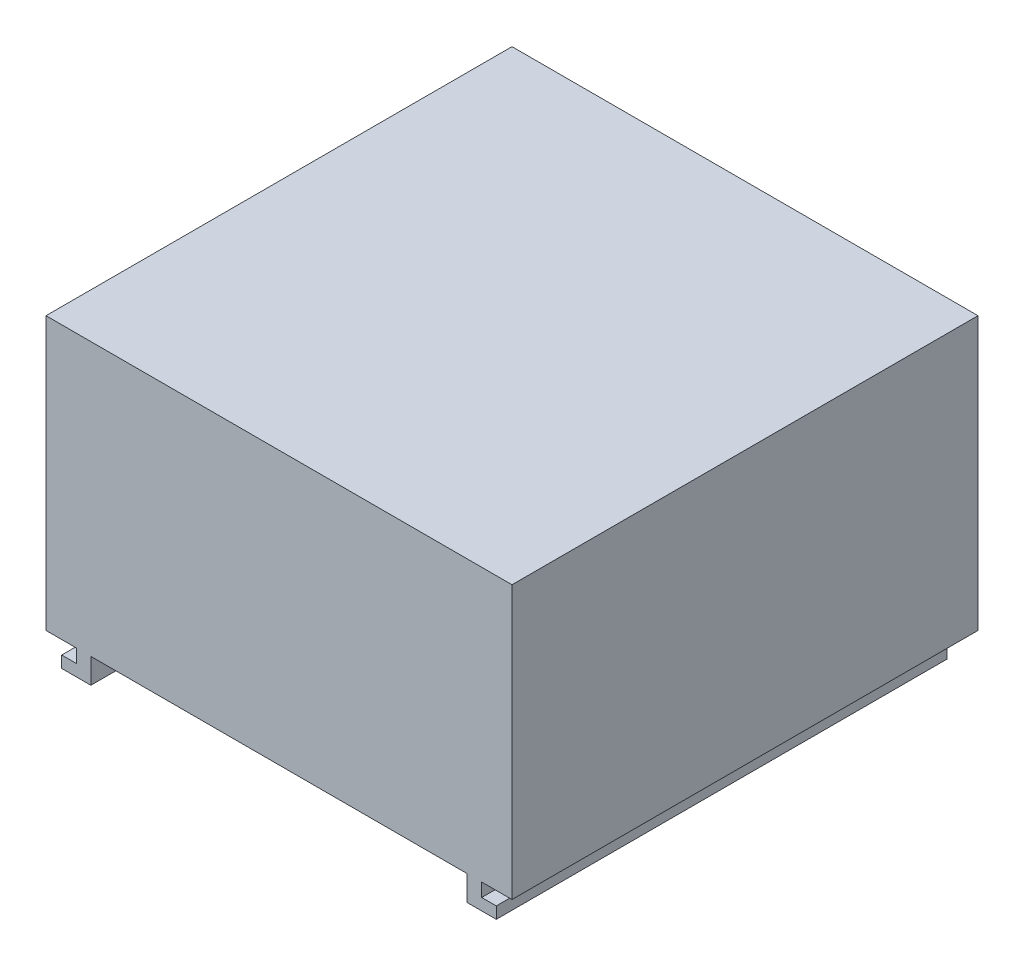
ISO-10303-21;
HEADER;
FILE_DESCRIPTION(('STEP AP214'),'2;1');
FILE_NAME('part.step','',(''),(''),'','','');
FILE_SCHEMA(('AUTOMOTIVE_DESIGN { 1 0 10303 214 1 1 1 1 }'));
ENDSEC;
DATA;
#1=APPLICATION_CONTEXT('core data for automotive mechanical design processes');
#2=APPLICATION_PROTOCOL_DEFINITION('international standard','automotive_design',2000,#1);
#3=PRODUCT_CONTEXT('',#1,'mechanical');
#4=PRODUCT('Part','Part','',(#3));
#5=PRODUCT_RELATED_PRODUCT_CATEGORY('part','',(#4));
#6=PRODUCT_DEFINITION_FORMATION('','',#4);
#7=PRODUCT_DEFINITION_CONTEXT('part definition',#1,'design');
#8=PRODUCT_DEFINITION('design','',#6,#7);
#9=PRODUCT_DEFINITION_SHAPE('','',#8);
#10=(LENGTH_UNIT() NAMED_UNIT(*) SI_UNIT(.MILLI.,.METRE.));
#11=(NAMED_UNIT(*) PLANE_ANGLE_UNIT() SI_UNIT($,.RADIAN.));
#12=(NAMED_UNIT(*) SI_UNIT($,.STERADIAN.) SOLID_ANGLE_UNIT());
#13=UNCERTAINTY_MEASURE_WITH_UNIT(LENGTH_MEASURE(1.E-05),#10,'distance_accuracy_value','');
#14=(GEOMETRIC_REPRESENTATION_CONTEXT(3) GLOBAL_UNCERTAINTY_ASSIGNED_CONTEXT((#13)) GLOBAL_UNIT_ASSIGNED_CONTEXT((#10,
#11,#12)) REPRESENTATION_CONTEXT('',''));
#15=CARTESIAN_POINT('',(0.,0.,0.));
#16=DIRECTION('',(0.,0.,1.));
#17=DIRECTION('',(1.,0.,0.));
#18=AXIS2_PLACEMENT_3D('',#15,#16,#17);
#19=CARTESIAN_POINT('',(-32.3,-6.301,38.5));
#20=DIRECTION('',(0.,0.,1.));
#21=DIRECTION('',(1.,0.,0.));
#22=AXIS2_PLACEMENT_3D('',#19,#20,#21);
#23=PLANE('',#22);
#24=DIRECTION('',(-1.,0.,0.));
#25=VECTOR('',#24,1.);
#26=CARTESIAN_POINT('',(-32.3,43.3,38.5));
#27=LINE('',#26,#25);
#28=CARTESIAN_POINT('',(38.5,43.3,38.5));
#29=VERTEX_POINT('',#28);
#30=CARTESIAN_POINT('',(-38.5,43.3,38.5));
#31=VERTEX_POINT('',#30);
#32=EDGE_CURVE('E201',#29,#31,#27,.T.);
#33=ORIENTED_EDGE('',*,*,#32,.F.);
#34=DIRECTION('',(0.,-1.,0.));
#35=VECTOR('',#34,1.);
#36=CARTESIAN_POINT('',(38.5,44.8,38.5));
#37=LINE('',#36,#35);
#38=CARTESIAN_POINT('',(38.5,0.,38.5));
#39=VERTEX_POINT('',#38);
#40=EDGE_CURVE('E206',#29,#39,#37,.T.);
#41=ORIENTED_EDGE('',*,*,#40,.T.);
#42=DIRECTION('',(1.,0.,0.));
#43=VECTOR('',#42,1.);
#44=CARTESIAN_POINT('',(-38.5,0.,38.5));
#45=LINE('',#44,#43);
#46=CARTESIAN_POINT('',(32.3,0.,38.5));
#47=VERTEX_POINT('',#46);
#48=EDGE_CURVE('E361',#47,#39,#45,.T.);
#49=ORIENTED_EDGE('',*,*,#48,.F.);
#50=DIRECTION('',(0.,1.,0.));
#51=VECTOR('',#50,1.);
#52=CARTESIAN_POINT('',(32.3,-6.301,38.5));
#53=LINE('',#52,#51);
#54=CARTESIAN_POINT('',(32.3,-1.99999999999999,38.5));
#55=VERTEX_POINT('',#54);
#56=EDGE_CURVE('E247',#55,#47,#53,.T.);
#57=ORIENTED_EDGE('',*,*,#56,.F.);
#58=DIRECTION('',(-1.,0.,0.));
#59=VECTOR('',#58,1.);
#60=CARTESIAN_POINT('',(-32.3,-2.,38.5));
#61=LINE('',#60,#59);
#62=CARTESIAN_POINT('',(-32.3,-2.,38.5));
#63=VERTEX_POINT('',#62);
#64=EDGE_CURVE('E237',#55,#63,#61,.T.);
#65=ORIENTED_EDGE('',*,*,#64,.T.);
#66=DIRECTION('',(0.,1.,0.));
#67=VECTOR('',#66,1.);
#68=CARTESIAN_POINT('',(-32.3,-6.301,38.5));
#69=LINE('',#68,#67);
#70=CARTESIAN_POINT('',(-32.3,0.,38.5));
#71=VERTEX_POINT('',#70);
#72=EDGE_CURVE('E251',#63,#71,#69,.T.);
#73=ORIENTED_EDGE('',*,*,#72,.T.);
#74=CARTESIAN_POINT('',(-38.5,0.,38.5));
#75=VERTEX_POINT('',#74);
#76=EDGE_CURVE('E505',#75,#71,#45,.T.);
#77=ORIENTED_EDGE('',*,*,#76,.F.);
#78=DIRECTION('',(0.,-1.,0.));
#79=VECTOR('',#78,1.);
#80=CARTESIAN_POINT('',(-38.5,44.8,38.5));
#81=LINE('',#80,#79);
#82=EDGE_CURVE('E208',#31,#75,#81,.T.);
#83=ORIENTED_EDGE('',*,*,#82,.F.);
#84=EDGE_LOOP('',(#33,#41,#49,#57,#65,#73,#77,#83));
#85=FACE_BOUND('',#84,.T.);
#86=ADVANCED_FACE('F41',(#85),#23,.F.);
#87=CARTESIAN_POINT('',(-32.3,-6.301,-38.5));
#88=DIRECTION('',(0.,0.,-1.));
#89=DIRECTION('',(-1.,0.,0.));
#90=AXIS2_PLACEMENT_3D('',#87,#88,#89);
#91=PLANE('',#90);
#92=DIRECTION('',(1.,0.,0.));
#93=VECTOR('',#92,1.);
#94=CARTESIAN_POINT('',(-32.3,43.3,-38.5));
#95=LINE('',#94,#93);
#96=CARTESIAN_POINT('',(-38.5,43.3,-38.5));
#97=VERTEX_POINT('',#96);
#98=CARTESIAN_POINT('',(38.5,43.3,-38.5));
#99=VERTEX_POINT('',#98);
#100=EDGE_CURVE('E56',#97,#99,#95,.T.);
#101=ORIENTED_EDGE('',*,*,#100,.F.);
#102=DIRECTION('',(0.,-1.,0.));
#103=VECTOR('',#102,1.);
#104=CARTESIAN_POINT('',(-38.5,44.8,-38.5));
#105=LINE('',#104,#103);
#106=CARTESIAN_POINT('',(-38.5,0.,-38.5));
#107=VERTEX_POINT('',#106);
#108=EDGE_CURVE('E218',#97,#107,#105,.T.);
#109=ORIENTED_EDGE('',*,*,#108,.T.);
#110=DIRECTION('',(-1.,0.,0.));
#111=VECTOR('',#110,1.);
#112=CARTESIAN_POINT('',(38.5,0.,-38.5));
#113=LINE('',#112,#111);
#114=CARTESIAN_POINT('',(-32.3,0.,-38.5));
#115=VERTEX_POINT('',#114);
#116=EDGE_CURVE('E49',#115,#107,#113,.T.);
#117=ORIENTED_EDGE('',*,*,#116,.F.);
#118=DIRECTION('',(0.,1.,0.));
#119=VECTOR('',#118,1.);
#120=CARTESIAN_POINT('',(-32.3,-6.301,-38.5));
#121=LINE('',#120,#119);
#122=CARTESIAN_POINT('',(-32.3,-2.,-38.5));
#123=VERTEX_POINT('',#122);
#124=EDGE_CURVE('E254',#123,#115,#121,.T.);
#125=ORIENTED_EDGE('',*,*,#124,.F.);
#126=DIRECTION('',(1.,0.,0.));
#127=VECTOR('',#126,1.);
#128=CARTESIAN_POINT('',(-32.3,-2.,-38.5));
#129=LINE('',#128,#127);
#130=CARTESIAN_POINT('',(32.3,-2.,-38.5));
#131=VERTEX_POINT('',#130);
#132=EDGE_CURVE('E250',#123,#131,#129,.T.);
#133=ORIENTED_EDGE('',*,*,#132,.T.);
#134=DIRECTION('',(0.,1.,0.));
#135=VECTOR('',#134,1.);
#136=CARTESIAN_POINT('',(32.3,-6.301,-38.5));
#137=LINE('',#136,#135);
#138=CARTESIAN_POINT('',(32.3,0.,-38.5));
#139=VERTEX_POINT('',#138);
#140=EDGE_CURVE('E246',#131,#139,#137,.T.);
#141=ORIENTED_EDGE('',*,*,#140,.T.);
#142=CARTESIAN_POINT('',(38.5,0.,-38.5));
#143=VERTEX_POINT('',#142);
#144=EDGE_CURVE('E501',#143,#139,#113,.T.);
#145=ORIENTED_EDGE('',*,*,#144,.F.);
#146=DIRECTION('',(0.,-1.,0.));
#147=VECTOR('',#146,1.);
#148=CARTESIAN_POINT('',(38.5,44.8,-38.5));
#149=LINE('',#148,#147);
#150=EDGE_CURVE('E62',#99,#143,#149,.T.);
#151=ORIENTED_EDGE('',*,*,#150,.F.);
#152=EDGE_LOOP('',(#101,#109,#117,#125,#133,#141,#145,#151));
#153=FACE_BOUND('',#152,.T.);
#154=ADVANCED_FACE('F449',(#153),#91,.F.);
#155=CARTESIAN_POINT('',(-38.5,44.8,-38.5));
#156=DIRECTION('',(1.,0.,0.));
#157=DIRECTION('',(0.,0.,-1.));
#158=AXIS2_PLACEMENT_3D('',#155,#156,#157);
#159=PLANE('',#158);
#160=ORIENTED_EDGE('',*,*,#108,.F.);
#161=DIRECTION('',(0.,0.,1.));
#162=VECTOR('',#161,1.);
#163=CARTESIAN_POINT('',(-38.5,43.3,-38.5));
#164=LINE('',#163,#162);
#165=EDGE_CURVE('E209',#97,#31,#164,.T.);
#166=ORIENTED_EDGE('',*,*,#165,.T.);
#167=ORIENTED_EDGE('',*,*,#82,.T.);
#168=DIRECTION('',(0.,0.,1.));
#169=VECTOR('',#168,1.);
#170=CARTESIAN_POINT('',(-38.5,0.,-38.5));
#171=LINE('',#170,#169);
#172=EDGE_CURVE('E499',#107,#75,#171,.T.);
#173=ORIENTED_EDGE('',*,*,#172,.F.);
#174=EDGE_LOOP('',(#160,#166,#167,#173));
#175=FACE_BOUND('',#174,.T.);
#176=ADVANCED_FACE('F467',(#175),#159,.T.);
#177=CARTESIAN_POINT('',(38.5,44.8,38.5));
#178=DIRECTION('',(-1.,0.,0.));
#179=DIRECTION('',(0.,0.,1.));
#180=AXIS2_PLACEMENT_3D('',#177,#178,#179);
#181=PLANE('',#180);
#182=ORIENTED_EDGE('',*,*,#40,.F.);
#183=DIRECTION('',(0.,0.,-1.));
#184=VECTOR('',#183,1.);
#185=CARTESIAN_POINT('',(38.5,43.3,38.5));
#186=LINE('',#185,#184);
#187=EDGE_CURVE('E12',#29,#99,#186,.T.);
#188=ORIENTED_EDGE('',*,*,#187,.T.);
#189=ORIENTED_EDGE('',*,*,#150,.T.);
#190=DIRECTION('',(0.,0.,-1.));
#191=VECTOR('',#190,1.);
#192=CARTESIAN_POINT('',(38.5,0.,38.5));
#193=LINE('',#192,#191);
#194=EDGE_CURVE('E213',#39,#143,#193,.T.);
#195=ORIENTED_EDGE('',*,*,#194,.F.);
#196=EDGE_LOOP('',(#182,#188,#189,#195));
#197=FACE_BOUND('',#196,.T.);
#198=ADVANCED_FACE('F211',(#197),#181,.T.);
#199=CARTESIAN_POINT('',(0.,0.,0.));
#200=DIRECTION('',(0.,1.,0.));
#201=DIRECTION('',(0.,0.,1.));
#202=AXIS2_PLACEMENT_3D('',#199,#200,#201);
#203=PLANE('',#202);
#204=DIRECTION('',(0.,0.,1.));
#205=VECTOR('',#204,1.);
#206=CARTESIAN_POINT('',(-32.3,0.,-38.5));
#207=LINE('',#206,#205);
#208=EDGE_CURVE('E243',#115,#71,#207,.T.);
#209=ORIENTED_EDGE('',*,*,#208,.F.);
#210=ORIENTED_EDGE('',*,*,#116,.T.);
#211=ORIENTED_EDGE('',*,*,#172,.T.);
#212=ORIENTED_EDGE('',*,*,#76,.T.);
#213=EDGE_LOOP('',(#209,#210,#211,#212));
#214=FACE_BOUND('',#213,.T.);
#215=ADVANCED_FACE('F491',(#214),#203,.T.);
#216=ORIENTED_EDGE('',*,*,#194,.T.);
#217=ORIENTED_EDGE('',*,*,#144,.T.);
#218=DIRECTION('',(0.,0.,-1.));
#219=VECTOR('',#218,1.);
#220=CARTESIAN_POINT('',(32.3,0.,-38.5));
#221=LINE('',#220,#219);
#222=EDGE_CURVE('E240',#47,#139,#221,.T.);
#223=ORIENTED_EDGE('',*,*,#222,.F.);
#224=ORIENTED_EDGE('',*,*,#48,.T.);
#225=EDGE_LOOP('',(#216,#217,#223,#224));
#226=FACE_BOUND('',#225,.T.);
#227=ADVANCED_FACE('F512',(#226),#203,.T.);
#228=CARTESIAN_POINT('',(0.,-2.,0.));
#229=DIRECTION('',(0.,1.,0.));
#230=DIRECTION('',(0.,0.,1.));
#231=AXIS2_PLACEMENT_3D('',#228,#229,#230);
#232=PLANE('',#231);
#233=DIRECTION('',(0.,0.,1.));
#234=VECTOR('',#233,1.);
#235=CARTESIAN_POINT('',(-32.3,-2.,-46.594694837519));
#236=LINE('',#235,#234);
#237=CARTESIAN_POINT('',(-32.3,-2.,40.));
#238=VERTEX_POINT('',#237);
#239=EDGE_CURVE('E336',#63,#238,#236,.T.);
#240=ORIENTED_EDGE('',*,*,#239,.F.);
#241=ORIENTED_EDGE('',*,*,#64,.F.);
#242=DIRECTION('',(0.,0.,1.));
#243=VECTOR('',#242,1.);
#244=CARTESIAN_POINT('',(32.3,-1.99999999999999,-46.594694837519));
#245=LINE('',#244,#243);
#246=CARTESIAN_POINT('',(32.3,-1.99999999999999,40.));
#247=VERTEX_POINT('',#246);
#248=EDGE_CURVE('E276',#55,#247,#245,.T.);
#249=ORIENTED_EDGE('',*,*,#248,.T.);
#250=DIRECTION('',(1.,0.,0.));
#251=VECTOR('',#250,1.);
#252=CARTESIAN_POINT('',(0.,-2.,40.));
#253=LINE('',#252,#251);
#254=EDGE_CURVE('E351',#238,#247,#253,.T.);
#255=ORIENTED_EDGE('',*,*,#254,.F.);
#256=EDGE_LOOP('',(#240,#241,#249,#255));
#257=FACE_BOUND('',#256,.T.);
#258=ADVANCED_FACE('F414',(#257),#232,.F.);
#259=DIRECTION('',(1.,0.,0.));
#260=VECTOR('',#259,1.);
#261=CARTESIAN_POINT('',(34.8,-1.99999999999999,-37.35));
#262=LINE('',#261,#260);
#263=CARTESIAN_POINT('',(32.3,-1.99999999999999,-37.35));
#264=VERTEX_POINT('',#263);
#265=CARTESIAN_POINT('',(34.8,-1.99999999999999,-37.35));
#266=VERTEX_POINT('',#265);
#267=EDGE_CURVE('E295',#264,#266,#262,.T.);
#268=ORIENTED_EDGE('',*,*,#267,.F.);
#269=DIRECTION('',(0.,0.,1.));
#270=VECTOR('',#269,1.);
#271=CARTESIAN_POINT('',(32.3,-1.99999999999999,-46.594694837519));
#272=LINE('',#271,#270);
#273=EDGE_CURVE('E233',#131,#264,#272,.T.);
#274=ORIENTED_EDGE('',*,*,#273,.F.);
#275=ORIENTED_EDGE('',*,*,#132,.F.);
#276=DIRECTION('',(0.,0.,-1.));
#277=VECTOR('',#276,1.);
#278=CARTESIAN_POINT('',(-32.3,-2.,-38.5));
#279=LINE('',#278,#277);
#280=CARTESIAN_POINT('',(-32.3,-2.,-37.35));
#281=VERTEX_POINT('',#280);
#282=EDGE_CURVE('E235',#281,#123,#279,.T.);
#283=ORIENTED_EDGE('',*,*,#282,.F.);
#284=DIRECTION('',(-1.,0.,0.));
#285=VECTOR('',#284,1.);
#286=CARTESIAN_POINT('',(0.,-2.,-37.35));
#287=LINE('',#286,#285);
#288=CARTESIAN_POINT('',(-34.8,-2.,-37.35));
#289=VERTEX_POINT('',#288);
#290=EDGE_CURVE('E312',#281,#289,#287,.T.);
#291=ORIENTED_EDGE('',*,*,#290,.T.);
#292=DIRECTION('',(0.,0.,1.));
#293=VECTOR('',#292,1.);
#294=CARTESIAN_POINT('',(-34.8,-2.,-46.594694837519));
#295=LINE('',#294,#293);
#296=CARTESIAN_POINT('',(-34.8,-2.,40.));
#297=VERTEX_POINT('',#296);
#298=EDGE_CURVE('E333',#289,#297,#295,.T.);
#299=ORIENTED_EDGE('',*,*,#298,.T.);
#300=CARTESIAN_POINT('',(-40.,-2.,40.));
#301=VERTEX_POINT('',#300);
#302=EDGE_CURVE('E347',#301,#297,#253,.T.);
#303=ORIENTED_EDGE('',*,*,#302,.F.);
#304=DIRECTION('',(0.,0.,-1.));
#305=VECTOR('',#304,1.);
#306=CARTESIAN_POINT('',(-40.,-2.,0.));
#307=LINE('',#306,#305);
#308=CARTESIAN_POINT('',(-40.,-2.,-40.));
#309=VERTEX_POINT('',#308);
#310=EDGE_CURVE('E356',#301,#309,#307,.T.);
#311=ORIENTED_EDGE('',*,*,#310,.T.);
#312=DIRECTION('',(1.,0.,0.));
#313=VECTOR('',#312,1.);
#314=CARTESIAN_POINT('',(0.,-2.,-40.));
#315=LINE('',#314,#313);
#316=CARTESIAN_POINT('',(40.,-2.,-40.));
#317=VERTEX_POINT('',#316);
#318=EDGE_CURVE('E354',#309,#317,#315,.T.);
#319=ORIENTED_EDGE('',*,*,#318,.T.);
#320=DIRECTION('',(0.,0.,-1.));
#321=VECTOR('',#320,1.);
#322=CARTESIAN_POINT('',(40.,-2.,0.));
#323=LINE('',#322,#321);
#324=CARTESIAN_POINT('',(40.,-2.,40.));
#325=VERTEX_POINT('',#324);
#326=EDGE_CURVE('E350',#325,#317,#323,.T.);
#327=ORIENTED_EDGE('',*,*,#326,.F.);
#328=CARTESIAN_POINT('',(34.8,-2.,40.));
#329=VERTEX_POINT('',#328);
#330=EDGE_CURVE('E318',#329,#325,#253,.T.);
#331=ORIENTED_EDGE('',*,*,#330,.F.);
#332=DIRECTION('',(0.,0.,1.));
#333=VECTOR('',#332,1.);
#334=CARTESIAN_POINT('',(34.8,-1.99999999999999,-46.594694837519));
#335=LINE('',#334,#333);
#336=EDGE_CURVE('E273',#266,#329,#335,.T.);
#337=ORIENTED_EDGE('',*,*,#336,.F.);
#338=EDGE_LOOP('',(#268,#274,#275,#283,#291,#299,#303,#311,#319,#327,#331,#337));
#339=FACE_BOUND('',#338,.T.);
#340=ADVANCED_FACE('F390',(#339),#232,.F.);
#341=CARTESIAN_POINT('',(0.,-2.,40.));
#342=DIRECTION('',(0.,0.,1.));
#343=DIRECTION('',(1.,0.,0.));
#344=AXIS2_PLACEMENT_3D('',#341,#342,#343);
#345=PLANE('',#344);
#346=DIRECTION('',(1.,0.,0.));
#347=VECTOR('',#346,1.);
#348=CARTESIAN_POINT('',(-40.,44.8,40.));
#349=LINE('',#348,#347);
#350=CARTESIAN_POINT('',(-40.,44.8,40.));
#351=VERTEX_POINT('',#350);
#352=CARTESIAN_POINT('',(40.,44.8,40.));
#353=VERTEX_POINT('',#352);
#354=EDGE_CURVE('E230',#351,#353,#349,.T.);
#355=ORIENTED_EDGE('',*,*,#354,.F.);
#356=DIRECTION('',(0.,1.,0.));
#357=VECTOR('',#356,1.);
#358=CARTESIAN_POINT('',(-40.,-2.,40.));
#359=LINE('',#358,#357);
#360=EDGE_CURVE('E359',#301,#351,#359,.T.);
#361=ORIENTED_EDGE('',*,*,#360,.F.);
#362=ORIENTED_EDGE('',*,*,#302,.T.);
#363=DIRECTION('',(0.,1.,0.));
#364=VECTOR('',#363,1.);
#365=CARTESIAN_POINT('',(-34.8,0.,40.));
#366=LINE('',#365,#364);
#367=CARTESIAN_POINT('',(-34.8,-4.3,40.));
#368=VERTEX_POINT('',#367);
#369=EDGE_CURVE('E292',#368,#297,#366,.T.);
#370=ORIENTED_EDGE('',*,*,#369,.F.);
#371=DIRECTION('',(1.,0.,0.));
#372=VECTOR('',#371,1.);
#373=CARTESIAN_POINT('',(0.,-4.3,40.));
#374=LINE('',#373,#372);
#375=CARTESIAN_POINT('',(-37.3,-4.3,40.));
#376=VERTEX_POINT('',#375);
#377=EDGE_CURVE('E320',#376,#368,#374,.T.);
#378=ORIENTED_EDGE('',*,*,#377,.F.);
#379=DIRECTION('',(0.,1.,0.));
#380=VECTOR('',#379,1.);
#381=CARTESIAN_POINT('',(-37.3,0.,40.));
#382=LINE('',#381,#380);
#383=CARTESIAN_POINT('',(-37.3,-6.3,40.));
#384=VERTEX_POINT('',#383);
#385=EDGE_CURVE('E323',#384,#376,#382,.T.);
#386=ORIENTED_EDGE('',*,*,#385,.F.);
#387=DIRECTION('',(-1.,0.,0.));
#388=VECTOR('',#387,1.);
#389=CARTESIAN_POINT('',(0.,-6.29999999999999,40.));
#390=LINE('',#389,#388);
#391=CARTESIAN_POINT('',(-32.3,-6.3,40.));
#392=VERTEX_POINT('',#391);
#393=EDGE_CURVE('E326',#392,#384,#390,.T.);
#394=ORIENTED_EDGE('',*,*,#393,.F.);
#395=DIRECTION('',(0.,-1.,0.));
#396=VECTOR('',#395,1.);
#397=CARTESIAN_POINT('',(-32.3,0.,40.));
#398=LINE('',#397,#396);
#399=EDGE_CURVE('E329',#238,#392,#398,.T.);
#400=ORIENTED_EDGE('',*,*,#399,.F.);
#401=ORIENTED_EDGE('',*,*,#254,.T.);
#402=DIRECTION('',(0.,-1.,0.));
#403=VECTOR('',#402,1.);
#404=CARTESIAN_POINT('',(32.3,-1.99999999999999,40.));
#405=LINE('',#404,#403);
#406=CARTESIAN_POINT('',(32.3,-6.29999999999999,40.));
#407=VERTEX_POINT('',#406);
#408=EDGE_CURVE('E289',#247,#407,#405,.T.);
#409=ORIENTED_EDGE('',*,*,#408,.T.);
#410=DIRECTION('',(1.,0.,0.));
#411=VECTOR('',#410,1.);
#412=CARTESIAN_POINT('',(32.3,-6.29999999999999,40.));
#413=LINE('',#412,#411);
#414=CARTESIAN_POINT('',(37.3,-6.3,40.));
#415=VERTEX_POINT('',#414);
#416=EDGE_CURVE('E286',#407,#415,#413,.T.);
#417=ORIENTED_EDGE('',*,*,#416,.T.);
#418=DIRECTION('',(0.,1.,0.));
#419=VECTOR('',#418,1.);
#420=CARTESIAN_POINT('',(37.3,-6.3,40.));
#421=LINE('',#420,#419);
#422=CARTESIAN_POINT('',(37.3,-4.3,40.));
#423=VERTEX_POINT('',#422);
#424=EDGE_CURVE('E283',#415,#423,#421,.T.);
#425=ORIENTED_EDGE('',*,*,#424,.T.);
#426=DIRECTION('',(-1.,0.,0.));
#427=VECTOR('',#426,1.);
#428=CARTESIAN_POINT('',(37.3,-4.3,40.));
#429=LINE('',#428,#427);
#430=CARTESIAN_POINT('',(34.8,-4.29999999999999,40.));
#431=VERTEX_POINT('',#430);
#432=EDGE_CURVE('E280',#423,#431,#429,.T.);
#433=ORIENTED_EDGE('',*,*,#432,.T.);
#434=DIRECTION('',(0.,1.,0.));
#435=VECTOR('',#434,1.);
#436=CARTESIAN_POINT('',(34.8,-4.29999999999999,40.));
#437=LINE('',#436,#435);
#438=EDGE_CURVE('E266',#431,#329,#437,.T.);
#439=ORIENTED_EDGE('',*,*,#438,.T.);
#440=ORIENTED_EDGE('',*,*,#330,.T.);
#441=DIRECTION('',(0.,1.,0.));
#442=VECTOR('',#441,1.);
#443=CARTESIAN_POINT('',(40.,-2.,40.));
#444=LINE('',#443,#442);
#445=EDGE_CURVE('E358',#325,#353,#444,.T.);
#446=ORIENTED_EDGE('',*,*,#445,.T.);
#447=EDGE_LOOP('',(#355,#361,#362,#370,#378,#386,#394,#400,#401,#409,#417,#425,#433,#439,#440,#446));
#448=FACE_BOUND('',#447,.T.);
#449=ADVANCED_FACE('F43',(#448),#345,.T.);
#450=CARTESIAN_POINT('',(-40.,-2.,0.));
#451=DIRECTION('',(1.,0.,0.));
#452=DIRECTION('',(0.,0.,-1.));
#453=AXIS2_PLACEMENT_3D('',#450,#451,#452);
#454=PLANE('',#453);
#455=DIRECTION('',(0.,0.,1.));
#456=VECTOR('',#455,1.);
#457=CARTESIAN_POINT('',(-40.,44.8,40.));
#458=LINE('',#457,#456);
#459=CARTESIAN_POINT('',(-40.,44.8,-40.));
#460=VERTEX_POINT('',#459);
#461=EDGE_CURVE('E227',#460,#351,#458,.T.);
#462=ORIENTED_EDGE('',*,*,#461,.F.);
#463=DIRECTION('',(0.,1.,0.));
#464=VECTOR('',#463,1.);
#465=CARTESIAN_POINT('',(-40.,-2.,-40.));
#466=LINE('',#465,#464);
#467=EDGE_CURVE('E362',#309,#460,#466,.T.);
#468=ORIENTED_EDGE('',*,*,#467,.F.);
#469=ORIENTED_EDGE('',*,*,#310,.F.);
#470=ORIENTED_EDGE('',*,*,#360,.T.);
#471=EDGE_LOOP('',(#462,#468,#469,#470));
#472=FACE_BOUND('',#471,.T.);
#473=ADVANCED_FACE('F383',(#472),#454,.F.);
#474=CARTESIAN_POINT('',(0.,-2.,-40.));
#475=DIRECTION('',(0.,0.,1.));
#476=DIRECTION('',(1.,0.,0.));
#477=AXIS2_PLACEMENT_3D('',#474,#475,#476);
#478=PLANE('',#477);
#479=DIRECTION('',(-1.,0.,0.));
#480=VECTOR('',#479,1.);
#481=CARTESIAN_POINT('',(-40.,44.8,-40.));
#482=LINE('',#481,#480);
#483=CARTESIAN_POINT('',(40.,44.8,-40.));
#484=VERTEX_POINT('',#483);
#485=EDGE_CURVE('E224',#484,#460,#482,.T.);
#486=ORIENTED_EDGE('',*,*,#485,.F.);
#487=DIRECTION('',(0.,1.,0.));
#488=VECTOR('',#487,1.);
#489=CARTESIAN_POINT('',(40.,-2.,-40.));
#490=LINE('',#489,#488);
#491=EDGE_CURVE('E364',#317,#484,#490,.T.);
#492=ORIENTED_EDGE('',*,*,#491,.F.);
#493=ORIENTED_EDGE('',*,*,#318,.F.);
#494=ORIENTED_EDGE('',*,*,#467,.T.);
#495=EDGE_LOOP('',(#486,#492,#493,#494));
#496=FACE_BOUND('',#495,.T.);
#497=ADVANCED_FACE('F380',(#496),#478,.F.);
#498=CARTESIAN_POINT('',(40.,-2.,0.));
#499=DIRECTION('',(1.,0.,0.));
#500=DIRECTION('',(0.,0.,-1.));
#501=AXIS2_PLACEMENT_3D('',#498,#499,#500);
#502=PLANE('',#501);
#503=DIRECTION('',(0.,0.,-1.));
#504=VECTOR('',#503,1.);
#505=CARTESIAN_POINT('',(40.,44.8,40.));
#506=LINE('',#505,#504);
#507=EDGE_CURVE('E216',#353,#484,#506,.T.);
#508=ORIENTED_EDGE('',*,*,#507,.F.);
#509=ORIENTED_EDGE('',*,*,#445,.F.);
#510=ORIENTED_EDGE('',*,*,#326,.T.);
#511=ORIENTED_EDGE('',*,*,#491,.T.);
#512=EDGE_LOOP('',(#508,#509,#510,#511));
#513=FACE_BOUND('',#512,.T.);
#514=ADVANCED_FACE('F375',(#513),#502,.T.);
#515=CARTESIAN_POINT('',(0.,-4.3,-46.594694837519));
#516=DIRECTION('',(0.,-1.,0.));
#517=DIRECTION('',(0.,0.,-1.));
#518=AXIS2_PLACEMENT_3D('',#515,#516,#517);
#519=PLANE('',#518);
#520=DIRECTION('',(0.,0.,1.));
#521=VECTOR('',#520,1.);
#522=CARTESIAN_POINT('',(-34.8,-4.3,-46.594694837519));
#523=LINE('',#522,#521);
#524=CARTESIAN_POINT('',(-34.8,-4.3,-37.35));
#525=VERTEX_POINT('',#524);
#526=EDGE_CURVE('E332',#525,#368,#523,.T.);
#527=ORIENTED_EDGE('',*,*,#526,.F.);
#528=DIRECTION('',(-1.,0.,0.));
#529=VECTOR('',#528,1.);
#530=CARTESIAN_POINT('',(0.,-4.3,-37.35));
#531=LINE('',#530,#529);
#532=CARTESIAN_POINT('',(-37.3,-4.3,-37.35));
#533=VERTEX_POINT('',#532);
#534=EDGE_CURVE('E306',#525,#533,#531,.T.);
#535=ORIENTED_EDGE('',*,*,#534,.T.);
#536=DIRECTION('',(0.,0.,1.));
#537=VECTOR('',#536,1.);
#538=CARTESIAN_POINT('',(-37.3,-4.3,-46.594694837519));
#539=LINE('',#538,#537);
#540=EDGE_CURVE('E342',#533,#376,#539,.T.);
#541=ORIENTED_EDGE('',*,*,#540,.T.);
#542=ORIENTED_EDGE('',*,*,#377,.T.);
#543=EDGE_LOOP('',(#527,#535,#541,#542));
#544=FACE_BOUND('',#543,.T.);
#545=ADVANCED_FACE('F397',(#544),#519,.F.);
#546=CARTESIAN_POINT('',(-37.3,0.,-46.594694837519));
#547=DIRECTION('',(1.,0.,0.));
#548=DIRECTION('',(0.,0.,-1.));
#549=AXIS2_PLACEMENT_3D('',#546,#547,#548);
#550=PLANE('',#549);
#551=ORIENTED_EDGE('',*,*,#540,.F.);
#552=DIRECTION('',(0.,-1.,0.));
#553=VECTOR('',#552,1.);
#554=CARTESIAN_POINT('',(-37.3,0.,-37.35));
#555=LINE('',#554,#553);
#556=CARTESIAN_POINT('',(-37.3,-6.3,-37.35));
#557=VERTEX_POINT('',#556);
#558=EDGE_CURVE('E302',#533,#557,#555,.T.);
#559=ORIENTED_EDGE('',*,*,#558,.T.);
#560=DIRECTION('',(0.,0.,1.));
#561=VECTOR('',#560,1.);
#562=CARTESIAN_POINT('',(-37.3,-6.3,-46.594694837519));
#563=LINE('',#562,#561);
#564=EDGE_CURVE('E340',#557,#384,#563,.T.);
#565=ORIENTED_EDGE('',*,*,#564,.T.);
#566=ORIENTED_EDGE('',*,*,#385,.T.);
#567=EDGE_LOOP('',(#551,#559,#565,#566));
#568=FACE_BOUND('',#567,.T.);
#569=ADVANCED_FACE('F403',(#568),#550,.F.);
#570=CARTESIAN_POINT('',(0.,-6.29999999999999,-46.594694837519));
#571=DIRECTION('',(0.,1.,0.));
#572=DIRECTION('',(-1.,0.,0.));
#573=AXIS2_PLACEMENT_3D('',#570,#571,#572);
#574=PLANE('',#573);
#575=ORIENTED_EDGE('',*,*,#564,.F.);
#576=DIRECTION('',(1.,0.,0.));
#577=VECTOR('',#576,1.);
#578=CARTESIAN_POINT('',(0.,-6.29999999999999,-37.35));
#579=LINE('',#578,#577);
#580=CARTESIAN_POINT('',(-32.3,-6.3,-37.35));
#581=VERTEX_POINT('',#580);
#582=EDGE_CURVE('E305',#557,#581,#579,.T.);
#583=ORIENTED_EDGE('',*,*,#582,.T.);
#584=DIRECTION('',(0.,0.,1.));
#585=VECTOR('',#584,1.);
#586=CARTESIAN_POINT('',(-32.3,-6.3,-46.594694837519));
#587=LINE('',#586,#585);
#588=EDGE_CURVE('E338',#581,#392,#587,.T.);
#589=ORIENTED_EDGE('',*,*,#588,.T.);
#590=ORIENTED_EDGE('',*,*,#393,.T.);
#591=EDGE_LOOP('',(#575,#583,#589,#590));
#592=FACE_BOUND('',#591,.T.);
#593=ADVANCED_FACE('F406',(#592),#574,.F.);
#594=CARTESIAN_POINT('',(-32.3,0.,-46.594694837519));
#595=DIRECTION('',(-1.,0.,0.));
#596=DIRECTION('',(0.,0.,1.));
#597=AXIS2_PLACEMENT_3D('',#594,#595,#596);
#598=PLANE('',#597);
#599=ORIENTED_EDGE('',*,*,#588,.F.);
#600=DIRECTION('',(0.,1.,0.));
#601=VECTOR('',#600,1.);
#602=CARTESIAN_POINT('',(-32.3,0.,-37.35));
#603=LINE('',#602,#601);
#604=EDGE_CURVE('E309',#581,#281,#603,.T.);
#605=ORIENTED_EDGE('',*,*,#604,.T.);
#606=ORIENTED_EDGE('',*,*,#282,.T.);
#607=ORIENTED_EDGE('',*,*,#124,.T.);
#608=ORIENTED_EDGE('',*,*,#208,.T.);
#609=ORIENTED_EDGE('',*,*,#72,.F.);
#610=ORIENTED_EDGE('',*,*,#239,.T.);
#611=ORIENTED_EDGE('',*,*,#399,.T.);
#612=EDGE_LOOP('',(#599,#605,#606,#607,#608,#609,#610,#611));
#613=FACE_BOUND('',#612,.T.);
#614=ADVANCED_FACE('F409',(#613),#598,.F.);
#615=CARTESIAN_POINT('',(-34.8,0.,-46.594694837519));
#616=DIRECTION('',(1.,0.,0.));
#617=DIRECTION('',(0.,0.,-1.));
#618=AXIS2_PLACEMENT_3D('',#615,#616,#617);
#619=PLANE('',#618);
#620=ORIENTED_EDGE('',*,*,#298,.F.);
#621=DIRECTION('',(0.,-1.,0.));
#622=VECTOR('',#621,1.);
#623=CARTESIAN_POINT('',(-34.8,0.,-37.35));
#624=LINE('',#623,#622);
#625=EDGE_CURVE('E315',#289,#525,#624,.T.);
#626=ORIENTED_EDGE('',*,*,#625,.T.);
#627=ORIENTED_EDGE('',*,*,#526,.T.);
#628=ORIENTED_EDGE('',*,*,#369,.T.);
#629=EDGE_LOOP('',(#620,#626,#627,#628));
#630=FACE_BOUND('',#629,.T.);
#631=ADVANCED_FACE('F394',(#630),#619,.F.);
#632=CARTESIAN_POINT('',(0.,-2.,-37.35));
#633=DIRECTION('',(0.,0.,1.));
#634=DIRECTION('',(1.,0.,0.));
#635=AXIS2_PLACEMENT_3D('',#632,#633,#634);
#636=PLANE('',#635);
#637=ORIENTED_EDGE('',*,*,#290,.F.);
#638=ORIENTED_EDGE('',*,*,#604,.F.);
#639=ORIENTED_EDGE('',*,*,#582,.F.);
#640=ORIENTED_EDGE('',*,*,#558,.F.);
#641=ORIENTED_EDGE('',*,*,#534,.F.);
#642=ORIENTED_EDGE('',*,*,#625,.F.);
#643=EDGE_LOOP('',(#637,#638,#639,#640,#641,#642));
#644=FACE_BOUND('',#643,.T.);
#645=ADVANCED_FACE('F451',(#644),#636,.F.);
#646=CARTESIAN_POINT('',(32.3,-1.99999999999999,-46.594694837519));
#647=DIRECTION('',(-1.,0.,0.));
#648=DIRECTION('',(0.,0.,1.));
#649=AXIS2_PLACEMENT_3D('',#646,#647,#648);
#650=PLANE('',#649);
#651=DIRECTION('',(0.,1.,0.));
#652=VECTOR('',#651,1.);
#653=CARTESIAN_POINT('',(32.3,-1.99999999999999,-37.35));
#654=LINE('',#653,#652);
#655=CARTESIAN_POINT('',(32.3,-6.29999999999999,-37.35));
#656=VERTEX_POINT('',#655);
#657=EDGE_CURVE('E263',#656,#264,#654,.T.);
#658=ORIENTED_EDGE('',*,*,#657,.F.);
#659=DIRECTION('',(0.,0.,1.));
#660=VECTOR('',#659,1.);
#661=CARTESIAN_POINT('',(32.3,-6.29999999999999,-46.594694837519));
#662=LINE('',#661,#660);
#663=EDGE_CURVE('E264',#656,#407,#662,.T.);
#664=ORIENTED_EDGE('',*,*,#663,.T.);
#665=ORIENTED_EDGE('',*,*,#408,.F.);
#666=ORIENTED_EDGE('',*,*,#248,.F.);
#667=ORIENTED_EDGE('',*,*,#56,.T.);
#668=ORIENTED_EDGE('',*,*,#222,.T.);
#669=ORIENTED_EDGE('',*,*,#140,.F.);
#670=ORIENTED_EDGE('',*,*,#273,.T.);
#671=EDGE_LOOP('',(#658,#664,#665,#666,#667,#668,#669,#670));
#672=FACE_BOUND('',#671,.T.);
#673=ADVANCED_FACE('F420',(#672),#650,.T.);
#674=CARTESIAN_POINT('',(34.8,-4.29999999999999,-46.594694837519));
#675=DIRECTION('',(1.,0.,0.));
#676=DIRECTION('',(0.,0.,-1.));
#677=AXIS2_PLACEMENT_3D('',#674,#675,#676);
#678=PLANE('',#677);
#679=DIRECTION('',(0.,-1.,0.));
#680=VECTOR('',#679,1.);
#681=CARTESIAN_POINT('',(34.8,-4.29999999999999,-37.35));
#682=LINE('',#681,#680);
#683=CARTESIAN_POINT('',(34.8,-4.29999999999999,-37.35));
#684=VERTEX_POINT('',#683);
#685=EDGE_CURVE('E297',#266,#684,#682,.T.);
#686=ORIENTED_EDGE('',*,*,#685,.F.);
#687=ORIENTED_EDGE('',*,*,#336,.T.);
#688=ORIENTED_EDGE('',*,*,#438,.F.);
#689=DIRECTION('',(0.,0.,1.));
#690=VECTOR('',#689,1.);
#691=CARTESIAN_POINT('',(34.8,-4.29999999999999,-46.594694837519));
#692=LINE('',#691,#690);
#693=EDGE_CURVE('E271',#684,#431,#692,.T.);
#694=ORIENTED_EDGE('',*,*,#693,.F.);
#695=EDGE_LOOP('',(#686,#687,#688,#694));
#696=FACE_BOUND('',#695,.T.);
#697=ADVANCED_FACE('F441',(#696),#678,.T.);
#698=CARTESIAN_POINT('',(37.3,-4.3,-46.594694837519));
#699=DIRECTION('',(0.,1.,0.));
#700=DIRECTION('',(-1.,0.,0.));
#701=AXIS2_PLACEMENT_3D('',#698,#699,#700);
#702=PLANE('',#701);
#703=DIRECTION('',(1.,0.,0.));
#704=VECTOR('',#703,1.);
#705=CARTESIAN_POINT('',(37.3,-4.3,-37.35));
#706=LINE('',#705,#704);
#707=CARTESIAN_POINT('',(37.3,-4.3,-37.35));
#708=VERTEX_POINT('',#707);
#709=EDGE_CURVE('E299',#684,#708,#706,.T.);
#710=ORIENTED_EDGE('',*,*,#709,.F.);
#711=ORIENTED_EDGE('',*,*,#693,.T.);
#712=ORIENTED_EDGE('',*,*,#432,.F.);
#713=DIRECTION('',(0.,0.,1.));
#714=VECTOR('',#713,1.);
#715=CARTESIAN_POINT('',(37.3,-4.3,-46.594694837519));
#716=LINE('',#715,#714);
#717=EDGE_CURVE('E269',#708,#423,#716,.T.);
#718=ORIENTED_EDGE('',*,*,#717,.F.);
#719=EDGE_LOOP('',(#710,#711,#712,#718));
#720=FACE_BOUND('',#719,.T.);
#721=ADVANCED_FACE('F435',(#720),#702,.T.);
#722=CARTESIAN_POINT('',(37.3,-6.3,-46.594694837519));
#723=DIRECTION('',(1.,0.,0.));
#724=DIRECTION('',(0.,0.,-1.));
#725=AXIS2_PLACEMENT_3D('',#722,#723,#724);
#726=PLANE('',#725);
#727=DIRECTION('',(0.,-1.,0.));
#728=VECTOR('',#727,1.);
#729=CARTESIAN_POINT('',(37.3,-6.3,-37.35));
#730=LINE('',#729,#728);
#731=CARTESIAN_POINT('',(37.3,-6.3,-37.35));
#732=VERTEX_POINT('',#731);
#733=EDGE_CURVE('E278',#708,#732,#730,.T.);
#734=ORIENTED_EDGE('',*,*,#733,.F.);
#735=ORIENTED_EDGE('',*,*,#717,.T.);
#736=ORIENTED_EDGE('',*,*,#424,.F.);
#737=DIRECTION('',(0.,0.,1.));
#738=VECTOR('',#737,1.);
#739=CARTESIAN_POINT('',(37.3,-6.3,-46.594694837519));
#740=LINE('',#739,#738);
#741=EDGE_CURVE('E267',#732,#415,#740,.T.);
#742=ORIENTED_EDGE('',*,*,#741,.F.);
#743=EDGE_LOOP('',(#734,#735,#736,#742));
#744=FACE_BOUND('',#743,.T.);
#745=ADVANCED_FACE('F430',(#744),#726,.T.);
#746=CARTESIAN_POINT('',(32.3,-6.29999999999999,-46.594694837519));
#747=DIRECTION('',(0.,-1.,0.));
#748=DIRECTION('',(1.,0.,0.));
#749=AXIS2_PLACEMENT_3D('',#746,#747,#748);
#750=PLANE('',#749);
#751=DIRECTION('',(-1.,0.,0.));
#752=VECTOR('',#751,1.);
#753=CARTESIAN_POINT('',(32.3,-6.29999999999999,-37.35));
#754=LINE('',#753,#752);
#755=EDGE_CURVE('E261',#732,#656,#754,.T.);
#756=ORIENTED_EDGE('',*,*,#755,.F.);
#757=ORIENTED_EDGE('',*,*,#741,.T.);
#758=ORIENTED_EDGE('',*,*,#416,.F.);
#759=ORIENTED_EDGE('',*,*,#663,.F.);
#760=EDGE_LOOP('',(#756,#757,#758,#759));
#761=FACE_BOUND('',#760,.T.);
#762=ADVANCED_FACE('F426',(#761),#750,.T.);
#763=CARTESIAN_POINT('',(0.,-2.,-37.35));
#764=DIRECTION('',(0.,0.,1.));
#765=DIRECTION('',(1.,0.,0.));
#766=AXIS2_PLACEMENT_3D('',#763,#764,#765);
#767=PLANE('',#766);
#768=ORIENTED_EDGE('',*,*,#657,.T.);
#769=ORIENTED_EDGE('',*,*,#267,.T.);
#770=ORIENTED_EDGE('',*,*,#685,.T.);
#771=ORIENTED_EDGE('',*,*,#709,.T.);
#772=ORIENTED_EDGE('',*,*,#733,.T.);
#773=ORIENTED_EDGE('',*,*,#755,.T.);
#774=EDGE_LOOP('',(#768,#769,#770,#771,#772,#773));
#775=FACE_BOUND('',#774,.T.);
#776=ADVANCED_FACE('F445',(#775),#767,.F.);
#777=CARTESIAN_POINT('',(0.,44.8,0.));
#778=DIRECTION('',(0.,-1.,0.));
#779=DIRECTION('',(0.,0.,-1.));
#780=AXIS2_PLACEMENT_3D('',#777,#778,#779);
#781=PLANE('',#780);
#782=ORIENTED_EDGE('',*,*,#507,.T.);
#783=ORIENTED_EDGE('',*,*,#485,.T.);
#784=ORIENTED_EDGE('',*,*,#461,.T.);
#785=ORIENTED_EDGE('',*,*,#354,.T.);
#786=EDGE_LOOP('',(#782,#783,#784,#785));
#787=FACE_BOUND('',#786,.T.);
#788=ADVANCED_FACE('F373',(#787),#781,.F.);
#789=CARTESIAN_POINT('',(0.,43.3,0.));
#790=DIRECTION('',(0.,1.,0.));
#791=DIRECTION('',(0.,0.,1.));
#792=AXIS2_PLACEMENT_3D('',#789,#790,#791);
#793=PLANE('',#792);
#794=ORIENTED_EDGE('',*,*,#165,.F.);
#795=ORIENTED_EDGE('',*,*,#100,.T.);
#796=ORIENTED_EDGE('',*,*,#187,.F.);
#797=ORIENTED_EDGE('',*,*,#32,.T.);
#798=EDGE_LOOP('',(#794,#795,#796,#797));
#799=FACE_BOUND('',#798,.T.);
#800=ADVANCED_FACE('F200',(#799),#793,.F.);
#801=CLOSED_SHELL('',(#86,#154,#176,#198,#215,#227,#258,#340,#449,#473,#497,#514,#545,#569,#593,
#614,#631,#645,#673,#697,#721,#745,#762,#776,#788,#800));
#802=MANIFOLD_SOLID_BREP('B2',#801);
#803=ADVANCED_BREP_SHAPE_REPRESENTATION('',(#18,#802),#14);
#804=SHAPE_DEFINITION_REPRESENTATION(#9,#803);
ENDSEC;
END-ISO-10303-21;
